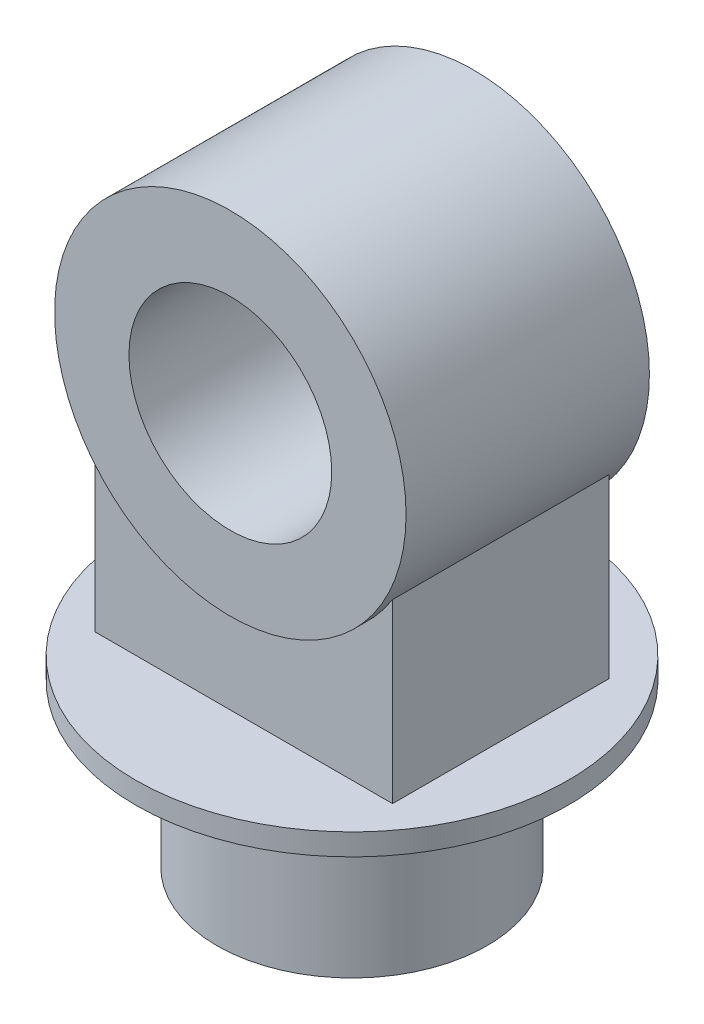
ISO-10303-21;
HEADER;
FILE_DESCRIPTION(('STEP AP214'),'2;1');
FILE_NAME('part.step','',(''),(''),'','','');
FILE_SCHEMA(('AUTOMOTIVE_DESIGN { 1 0 10303 214 1 1 1 1 }'));
ENDSEC;
DATA;
#1=APPLICATION_CONTEXT('core data for automotive mechanical design processes');
#2=APPLICATION_PROTOCOL_DEFINITION('international standard','automotive_design',2000,#1);
#3=PRODUCT_CONTEXT('',#1,'mechanical');
#4=PRODUCT('Part','Part','',(#3));
#5=PRODUCT_RELATED_PRODUCT_CATEGORY('part','',(#4));
#6=PRODUCT_DEFINITION_FORMATION('','',#4);
#7=PRODUCT_DEFINITION_CONTEXT('part definition',#1,'design');
#8=PRODUCT_DEFINITION('design','',#6,#7);
#9=PRODUCT_DEFINITION_SHAPE('','',#8);
#10=(LENGTH_UNIT() NAMED_UNIT(*) SI_UNIT(.MILLI.,.METRE.));
#11=(NAMED_UNIT(*) PLANE_ANGLE_UNIT() SI_UNIT($,.RADIAN.));
#12=(NAMED_UNIT(*) SI_UNIT($,.STERADIAN.) SOLID_ANGLE_UNIT());
#13=UNCERTAINTY_MEASURE_WITH_UNIT(LENGTH_MEASURE(1.E-05),#10,'distance_accuracy_value','');
#14=(GEOMETRIC_REPRESENTATION_CONTEXT(3) GLOBAL_UNCERTAINTY_ASSIGNED_CONTEXT((#13)) GLOBAL_UNIT_ASSIGNED_CONTEXT((#10,
#11,#12)) REPRESENTATION_CONTEXT('',''));
#15=CARTESIAN_POINT('',(0.,0.,0.));
#16=DIRECTION('',(0.,0.,1.));
#17=DIRECTION('',(1.,0.,0.));
#18=AXIS2_PLACEMENT_3D('',#15,#16,#17);
#19=CARTESIAN_POINT('',(0.,120.,0.));
#20=DIRECTION('',(0.,-1.,0.));
#21=DIRECTION('',(0.,0.,-1.));
#22=AXIS2_PLACEMENT_3D('',#19,#20,#21);
#23=CYLINDRICAL_SURFACE('',#22,100.);
#24=CARTESIAN_POINT('',(0.,120.,0.));
#25=DIRECTION('',(0.,1.,0.));
#26=DIRECTION('',(0.,0.,1.));
#27=AXIS2_PLACEMENT_3D('',#24,#25,#26);
#28=CIRCLE('',#27,100.);
#29=CARTESIAN_POINT('',(0.,120.,100.));
#30=VERTEX_POINT('',#29);
#31=EDGE_CURVE('E11',#30,#30,#28,.T.);
#32=ORIENTED_EDGE('',*,*,#31,.F.);
#33=EDGE_LOOP('',(#32));
#34=FACE_BOUND('',#33,.T.);
#35=CARTESIAN_POINT('',(0.,0.,0.));
#36=DIRECTION('',(0.,1.,0.));
#37=DIRECTION('',(0.,0.,1.));
#38=AXIS2_PLACEMENT_3D('',#35,#36,#37);
#39=CIRCLE('',#38,100.);
#40=CARTESIAN_POINT('',(0.,0.,100.));
#41=VERTEX_POINT('',#40);
#42=EDGE_CURVE('E48',#41,#41,#39,.T.);
#43=ORIENTED_EDGE('',*,*,#42,.T.);
#44=EDGE_LOOP('',(#43));
#45=FACE_BOUND('',#44,.T.);
#46=ADVANCED_FACE('F45',(#34,#45),#23,.T.);
#47=CARTESIAN_POINT('',(0.,0.,0.));
#48=DIRECTION('',(0.,1.,0.));
#49=DIRECTION('',(0.,0.,1.));
#50=AXIS2_PLACEMENT_3D('',#47,#48,#49);
#51=PLANE('',#50);
#52=ORIENTED_EDGE('',*,*,#42,.F.);
#53=EDGE_LOOP('',(#52));
#54=FACE_BOUND('',#53,.T.);
#55=ADVANCED_FACE('F121',(#54),#51,.F.);
#56=CARTESIAN_POINT('',(0.,136.,0.));
#57=DIRECTION('',(0.,-1.,0.));
#58=DIRECTION('',(0.,0.,-1.));
#59=AXIS2_PLACEMENT_3D('',#56,#57,#58);
#60=CYLINDRICAL_SURFACE('',#59,160.);
#61=CARTESIAN_POINT('',(0.,136.,0.));
#62=DIRECTION('',(0.,1.,0.));
#63=DIRECTION('',(0.,0.,1.));
#64=AXIS2_PLACEMENT_3D('',#61,#62,#63);
#65=CIRCLE('',#64,160.);
#66=CARTESIAN_POINT('',(0.,136.,160.));
#67=VERTEX_POINT('',#66);
#68=EDGE_CURVE('E108',#67,#67,#65,.T.);
#69=ORIENTED_EDGE('',*,*,#68,.F.);
#70=EDGE_LOOP('',(#69));
#71=FACE_BOUND('',#70,.T.);
#72=CARTESIAN_POINT('',(0.,120.,0.));
#73=DIRECTION('',(0.,1.,0.));
#74=DIRECTION('',(0.,0.,1.));
#75=AXIS2_PLACEMENT_3D('',#72,#73,#74);
#76=CIRCLE('',#75,160.);
#77=CARTESIAN_POINT('',(0.,120.,160.));
#78=VERTEX_POINT('',#77);
#79=EDGE_CURVE('E105',#78,#78,#76,.T.);
#80=ORIENTED_EDGE('',*,*,#79,.T.);
#81=EDGE_LOOP('',(#80));
#82=FACE_BOUND('',#81,.T.);
#83=ADVANCED_FACE('F123',(#71,#82),#60,.T.);
#84=CARTESIAN_POINT('',(0.,136.,0.));
#85=DIRECTION('',(0.,1.,0.));
#86=DIRECTION('',(0.,0.,1.));
#87=AXIS2_PLACEMENT_3D('',#84,#85,#86);
#88=PLANE('',#87);
#89=DIRECTION('',(0.,0.,1.));
#90=VECTOR('',#89,1.);
#91=CARTESIAN_POINT('',(-110.,136.,80.0000000000001));
#92=LINE('',#91,#90);
#93=CARTESIAN_POINT('',(-110.,136.,-79.9999999999999));
#94=VERTEX_POINT('',#93);
#95=CARTESIAN_POINT('',(-110.,136.,80.0000000000001));
#96=VERTEX_POINT('',#95);
#97=EDGE_CURVE('E59',#94,#96,#92,.T.);
#98=ORIENTED_EDGE('',*,*,#97,.F.);
#99=DIRECTION('',(-1.,0.,0.));
#100=VECTOR('',#99,1.);
#101=CARTESIAN_POINT('',(110.,136.,-80.));
#102=LINE('',#101,#100);
#103=CARTESIAN_POINT('',(110.,136.,-80.));
#104=VERTEX_POINT('',#103);
#105=EDGE_CURVE('E64',#104,#94,#102,.T.);
#106=ORIENTED_EDGE('',*,*,#105,.F.);
#107=DIRECTION('',(0.,0.,-1.));
#108=VECTOR('',#107,1.);
#109=CARTESIAN_POINT('',(110.,136.,80.));
#110=LINE('',#109,#108);
#111=CARTESIAN_POINT('',(110.,136.,80.));
#112=VERTEX_POINT('',#111);
#113=EDGE_CURVE('E185',#112,#104,#110,.T.);
#114=ORIENTED_EDGE('',*,*,#113,.F.);
#115=DIRECTION('',(1.,0.,0.));
#116=VECTOR('',#115,1.);
#117=CARTESIAN_POINT('',(110.,136.,80.));
#118=LINE('',#117,#116);
#119=EDGE_CURVE('E90',#96,#112,#118,.T.);
#120=ORIENTED_EDGE('',*,*,#119,.F.);
#121=EDGE_LOOP('',(#98,#106,#114,#120));
#122=FACE_BOUND('',#121,.T.);
#123=ORIENTED_EDGE('',*,*,#68,.T.);
#124=EDGE_LOOP('',(#123));
#125=FACE_BOUND('',#124,.T.);
#126=ADVANCED_FACE('F128',(#122,#125),#88,.T.);
#127=CARTESIAN_POINT('',(0.,120.,0.));
#128=DIRECTION('',(0.,1.,0.));
#129=DIRECTION('',(0.,0.,1.));
#130=AXIS2_PLACEMENT_3D('',#127,#128,#129);
#131=PLANE('',#130);
#132=ORIENTED_EDGE('',*,*,#31,.T.);
#133=EDGE_LOOP('',(#132));
#134=FACE_BOUND('',#133,.T.);
#135=ORIENTED_EDGE('',*,*,#79,.F.);
#136=EDGE_LOOP('',(#135));
#137=FACE_BOUND('',#136,.T.);
#138=ADVANCED_FACE('F133',(#134,#137),#131,.F.);
#139=CARTESIAN_POINT('',(110.,466.002,80.));
#140=DIRECTION('',(0.,0.,-1.));
#141=DIRECTION('',(-1.,0.,0.));
#142=AXIS2_PLACEMENT_3D('',#139,#140,#141);
#143=PLANE('',#142);
#144=CARTESIAN_POINT('',(0.,336.,80.));
#145=DIRECTION('',(0.,0.,-1.));
#146=DIRECTION('',(-1.,0.,0.));
#147=AXIS2_PLACEMENT_3D('',#144,#145,#146);
#148=CIRCLE('',#147,130.);
#149=CARTESIAN_POINT('',(-110.,266.717967697245,80.0000000000001));
#150=VERTEX_POINT('',#149);
#151=CARTESIAN_POINT('',(110.,266.717967697245,80.));
#152=VERTEX_POINT('',#151);
#153=EDGE_CURVE('E100',#150,#152,#148,.F.);
#154=ORIENTED_EDGE('',*,*,#153,.F.);
#155=DIRECTION('',(0.,-1.,0.));
#156=VECTOR('',#155,1.);
#157=CARTESIAN_POINT('',(-110.,466.002,80.0000000000001));
#158=LINE('',#157,#156);
#159=EDGE_CURVE('E97',#150,#96,#158,.T.);
#160=ORIENTED_EDGE('',*,*,#159,.T.);
#161=ORIENTED_EDGE('',*,*,#119,.T.);
#162=DIRECTION('',(0.,-1.,0.));
#163=VECTOR('',#162,1.);
#164=CARTESIAN_POINT('',(110.,466.002,80.));
#165=LINE('',#164,#163);
#166=EDGE_CURVE('E191',#152,#112,#165,.T.);
#167=ORIENTED_EDGE('',*,*,#166,.F.);
#168=EDGE_LOOP('',(#154,#160,#161,#167));
#169=FACE_BOUND('',#168,.T.);
#170=ADVANCED_FACE('F136',(#169),#143,.F.);
#171=CARTESIAN_POINT('',(-110.,466.002,80.0000000000001));
#172=DIRECTION('',(1.,0.,0.));
#173=DIRECTION('',(0.,0.,-1.));
#174=AXIS2_PLACEMENT_3D('',#171,#172,#173);
#175=PLANE('',#174);
#176=DIRECTION('',(0.,0.,-1.));
#177=VECTOR('',#176,1.);
#178=CARTESIAN_POINT('',(-110.,266.717967697245,90.));
#179=LINE('',#178,#177);
#180=CARTESIAN_POINT('',(-110.,266.717967697245,-79.9999999999999));
#181=VERTEX_POINT('',#180);
#182=EDGE_CURVE('E94',#181,#150,#179,.F.);
#183=ORIENTED_EDGE('',*,*,#182,.F.);
#184=DIRECTION('',(0.,-1.,0.));
#185=VECTOR('',#184,1.);
#186=CARTESIAN_POINT('',(-110.,466.002,-79.9999999999999));
#187=LINE('',#186,#185);
#188=EDGE_CURVE('E82',#181,#94,#187,.T.);
#189=ORIENTED_EDGE('',*,*,#188,.T.);
#190=ORIENTED_EDGE('',*,*,#97,.T.);
#191=ORIENTED_EDGE('',*,*,#159,.F.);
#192=EDGE_LOOP('',(#183,#189,#190,#191));
#193=FACE_BOUND('',#192,.T.);
#194=ADVANCED_FACE('F95',(#193),#175,.F.);
#195=CARTESIAN_POINT('',(110.,466.002,80.));
#196=DIRECTION('',(-1.,0.,0.));
#197=DIRECTION('',(0.,0.,1.));
#198=AXIS2_PLACEMENT_3D('',#195,#196,#197);
#199=PLANE('',#198);
#200=DIRECTION('',(0.,0.,-1.));
#201=VECTOR('',#200,1.);
#202=CARTESIAN_POINT('',(110.,266.717967697245,90.));
#203=LINE('',#202,#201);
#204=CARTESIAN_POINT('',(110.,266.717967697245,-80.));
#205=VERTEX_POINT('',#204);
#206=EDGE_CURVE('E104',#152,#205,#203,.T.);
#207=ORIENTED_EDGE('',*,*,#206,.F.);
#208=ORIENTED_EDGE('',*,*,#166,.T.);
#209=ORIENTED_EDGE('',*,*,#113,.T.);
#210=DIRECTION('',(0.,-1.,0.));
#211=VECTOR('',#210,1.);
#212=CARTESIAN_POINT('',(110.,466.002,-80.));
#213=LINE('',#212,#211);
#214=EDGE_CURVE('E89',#205,#104,#213,.T.);
#215=ORIENTED_EDGE('',*,*,#214,.F.);
#216=EDGE_LOOP('',(#207,#208,#209,#215));
#217=FACE_BOUND('',#216,.T.);
#218=ADVANCED_FACE('F142',(#217),#199,.F.);
#219=CARTESIAN_POINT('',(110.,466.002,-80.));
#220=DIRECTION('',(0.,0.,1.));
#221=DIRECTION('',(1.,0.,0.));
#222=AXIS2_PLACEMENT_3D('',#219,#220,#221);
#223=PLANE('',#222);
#224=CARTESIAN_POINT('',(0.,336.,-80.));
#225=DIRECTION('',(0.,0.,1.));
#226=DIRECTION('',(1.,0.,0.));
#227=AXIS2_PLACEMENT_3D('',#224,#225,#226);
#228=CIRCLE('',#227,130.);
#229=EDGE_CURVE('E86',#205,#181,#228,.F.);
#230=ORIENTED_EDGE('',*,*,#229,.F.);
#231=ORIENTED_EDGE('',*,*,#214,.T.);
#232=ORIENTED_EDGE('',*,*,#105,.T.);
#233=ORIENTED_EDGE('',*,*,#188,.F.);
#234=EDGE_LOOP('',(#230,#231,#232,#233));
#235=FACE_BOUND('',#234,.T.);
#236=ADVANCED_FACE('F84',(#235),#223,.F.);
#237=CARTESIAN_POINT('',(0.,336.,90.));
#238=DIRECTION('',(0.,0.,-1.));
#239=DIRECTION('',(-1.,0.,0.));
#240=AXIS2_PLACEMENT_3D('',#237,#238,#239);
#241=CYLINDRICAL_SURFACE('',#240,130.);
#242=CARTESIAN_POINT('',(0.,336.,90.));
#243=DIRECTION('',(0.,0.,1.));
#244=DIRECTION('',(1.,0.,0.));
#245=AXIS2_PLACEMENT_3D('',#242,#243,#244);
#246=CIRCLE('',#245,130.);
#247=CARTESIAN_POINT('',(130.,336.,90.));
#248=VERTEX_POINT('',#247);
#249=EDGE_CURVE('E173',#248,#248,#246,.T.);
#250=ORIENTED_EDGE('',*,*,#249,.F.);
#251=EDGE_LOOP('',(#250));
#252=FACE_BOUND('',#251,.T.);
#253=CARTESIAN_POINT('',(0.,336.,-90.));
#254=DIRECTION('',(0.,0.,1.));
#255=DIRECTION('',(1.,0.,0.));
#256=AXIS2_PLACEMENT_3D('',#253,#254,#255);
#257=CIRCLE('',#256,130.);
#258=CARTESIAN_POINT('',(130.,336.,-90.));
#259=VERTEX_POINT('',#258);
#260=EDGE_CURVE('E176',#259,#259,#257,.T.);
#261=ORIENTED_EDGE('',*,*,#260,.T.);
#262=EDGE_LOOP('',(#261));
#263=FACE_BOUND('',#262,.T.);
#264=ORIENTED_EDGE('',*,*,#182,.T.);
#265=ORIENTED_EDGE('',*,*,#153,.T.);
#266=ORIENTED_EDGE('',*,*,#206,.T.);
#267=ORIENTED_EDGE('',*,*,#229,.T.);
#268=EDGE_LOOP('',(#264,#265,#266,#267));
#269=FACE_BOUND('',#268,.T.);
#270=ADVANCED_FACE('F103',(#252,#263,#269),#241,.T.);
#271=CARTESIAN_POINT('',(0.,336.,90.));
#272=DIRECTION('',(0.,0.,-1.));
#273=DIRECTION('',(-1.,0.,0.));
#274=AXIS2_PLACEMENT_3D('',#271,#272,#273);
#275=CYLINDRICAL_SURFACE('',#274,75.);
#276=CARTESIAN_POINT('',(0.,336.,90.));
#277=DIRECTION('',(0.,0.,1.));
#278=DIRECTION('',(1.,0.,0.));
#279=AXIS2_PLACEMENT_3D('',#276,#277,#278);
#280=CIRCLE('',#279,75.);
#281=CARTESIAN_POINT('',(-75.,336.,90.));
#282=VERTEX_POINT('',#281);
#283=EDGE_CURVE('E170',#282,#282,#280,.T.);
#284=CARTESIAN_POINT('',(0.,336.,-90.));
#285=DIRECTION('',(0.,0.,1.));
#286=DIRECTION('',(1.,0.,0.));
#287=AXIS2_PLACEMENT_3D('',#284,#285,#286);
#288=CIRCLE('',#287,75.);
#289=CARTESIAN_POINT('',(-75.,336.,-90.));
#290=VERTEX_POINT('',#289);
#291=EDGE_CURVE('E179',#290,#290,#288,.T.);
#292=CARTESIAN_POINT('',(-75.,336.,90.));
#293=CARTESIAN_POINT('',(-75.,336.,88.125));
#294=CARTESIAN_POINT('',(-75.,336.,86.25));
#295=CARTESIAN_POINT('',(-75.,336.,82.5));
#296=CARTESIAN_POINT('',(-75.,336.,80.625));
#297=CARTESIAN_POINT('',(-75.,336.,76.875));
#298=CARTESIAN_POINT('',(-75.,336.,75.));
#299=CARTESIAN_POINT('',(-75.,336.,71.25));
#300=CARTESIAN_POINT('',(-75.,336.,69.375));
#301=CARTESIAN_POINT('',(-75.,336.,65.625));
#302=CARTESIAN_POINT('',(-75.,336.,63.75));
#303=CARTESIAN_POINT('',(-75.,336.,60.));
#304=CARTESIAN_POINT('',(-75.,336.,58.125));
#305=CARTESIAN_POINT('',(-75.,336.,54.375));
#306=CARTESIAN_POINT('',(-75.,336.,52.5));
#307=CARTESIAN_POINT('',(-75.,336.,48.75));
#308=CARTESIAN_POINT('',(-75.,336.,46.875));
#309=CARTESIAN_POINT('',(-75.,336.,43.125));
#310=CARTESIAN_POINT('',(-75.,336.,41.25));
#311=CARTESIAN_POINT('',(-75.,336.,37.5));
#312=CARTESIAN_POINT('',(-75.,336.,35.625));
#313=CARTESIAN_POINT('',(-75.,336.,31.875));
#314=CARTESIAN_POINT('',(-75.,336.,30.));
#315=CARTESIAN_POINT('',(-75.,336.,26.25));
#316=CARTESIAN_POINT('',(-75.,336.,24.375));
#317=CARTESIAN_POINT('',(-75.,336.,20.625));
#318=CARTESIAN_POINT('',(-75.,336.,18.75));
#319=CARTESIAN_POINT('',(-75.,336.,15.));
#320=CARTESIAN_POINT('',(-75.,336.,13.125));
#321=CARTESIAN_POINT('',(-75.,336.,9.37499999999998));
#322=CARTESIAN_POINT('',(-75.,336.,7.49999999999998));
#323=CARTESIAN_POINT('',(-75.,336.,3.74999999999998));
#324=CARTESIAN_POINT('',(-75.,336.,1.87499999999997));
#325=CARTESIAN_POINT('',(-75.,336.,-1.87500000000003));
#326=CARTESIAN_POINT('',(-75.,336.,-3.75000000000003));
#327=CARTESIAN_POINT('',(-75.,336.,-7.50000000000003));
#328=CARTESIAN_POINT('',(-75.,336.,-9.37500000000004));
#329=CARTESIAN_POINT('',(-75.,336.,-13.125));
#330=CARTESIAN_POINT('',(-75.,336.,-15.));
#331=CARTESIAN_POINT('',(-75.,336.,-18.75));
#332=CARTESIAN_POINT('',(-75.,336.,-20.625));
#333=CARTESIAN_POINT('',(-75.,336.,-24.375));
#334=CARTESIAN_POINT('',(-75.,336.,-26.25));
#335=CARTESIAN_POINT('',(-75.,336.,-30.));
#336=CARTESIAN_POINT('',(-75.,336.,-31.875));
#337=CARTESIAN_POINT('',(-75.,336.,-35.625));
#338=CARTESIAN_POINT('',(-75.,336.,-37.5));
#339=CARTESIAN_POINT('',(-75.,336.,-41.25));
#340=CARTESIAN_POINT('',(-75.,336.,-43.125));
#341=CARTESIAN_POINT('',(-75.,336.,-46.875));
#342=CARTESIAN_POINT('',(-75.,336.,-48.75));
#343=CARTESIAN_POINT('',(-75.,336.,-52.5));
#344=CARTESIAN_POINT('',(-75.,336.,-54.375));
#345=CARTESIAN_POINT('',(-75.,336.,-58.125));
#346=CARTESIAN_POINT('',(-75.,336.,-60.));
#347=CARTESIAN_POINT('',(-75.,336.,-63.75));
#348=CARTESIAN_POINT('',(-75.,336.,-65.625));
#349=CARTESIAN_POINT('',(-75.,336.,-69.375));
#350=CARTESIAN_POINT('',(-75.,336.,-71.25));
#351=CARTESIAN_POINT('',(-75.,336.,-75.));
#352=CARTESIAN_POINT('',(-75.,336.,-76.875));
#353=CARTESIAN_POINT('',(-75.,336.,-80.625));
#354=CARTESIAN_POINT('',(-75.,336.,-82.5));
#355=CARTESIAN_POINT('',(-75.,336.,-86.25));
#356=CARTESIAN_POINT('',(-75.,336.,-88.125));
#357=CARTESIAN_POINT('',(-75.,336.,-90.));
#358=B_SPLINE_CURVE_WITH_KNOTS('',3,(#292,#293,#294,#295,#296,#297,#298,#299,#300,#301,#302,
#303,#304,#305,#306,#307,#308,#309,#310,#311,#312,#313,#314,#315,#316,#317,#318,#319,#320,#321,
#322,#323,#324,#325,#326,#327,#328,#329,#330,#331,#332,#333,#334,#335,#336,#337,#338,#339,#340,
#341,#342,#343,#344,#345,#346,#347,#348,#349,#350,#351,#352,#353,#354,#355,#356,#357),
.UNSPECIFIED.,.F.,.F.,(4,2,2,2,2,2,2,2,2,2,2,2,2,2,2,2,2,2,2,2,2,2,2,2,2,2,2,2,2,2,2,2,4),(0.,
5.62499999999999,11.25,16.875,22.5,28.125,33.75,39.375,45.,50.625,56.25,61.875,67.5,73.125,
78.75,84.375,90.,95.625,101.25,106.875,112.5,118.125,123.75,129.375,135.,140.625,146.25,151.875,
157.5,163.125,168.75,174.375,180.),.UNSPECIFIED.);
#359=EDGE_CURVE('BSEAM151',#282,#290,#358,.T.);
#360=ORIENTED_EDGE('',*,*,#283,.T.);
#361=ORIENTED_EDGE('',*,*,#291,.F.);
#362=ORIENTED_EDGE('',*,*,#359,.T.);
#363=ORIENTED_EDGE('',*,*,#359,.F.);
#364=EDGE_LOOP('',(#360,#362,#361,#363));
#365=FACE_BOUND('',#364,.T.);
#366=ADVANCED_FACE('F151',(#365),#275,.F.);
#367=CARTESIAN_POINT('',(0.,0.,90.));
#368=DIRECTION('',(0.,0.,1.));
#369=DIRECTION('',(1.,0.,0.));
#370=AXIS2_PLACEMENT_3D('',#367,#368,#369);
#371=PLANE('',#370);
#372=ORIENTED_EDGE('',*,*,#283,.F.);
#373=EDGE_LOOP('',(#372));
#374=FACE_BOUND('',#373,.T.);
#375=ORIENTED_EDGE('',*,*,#249,.T.);
#376=EDGE_LOOP('',(#375));
#377=FACE_BOUND('',#376,.T.);
#378=ADVANCED_FACE('F154',(#374,#377),#371,.T.);
#379=CARTESIAN_POINT('',(0.,0.,-90.));
#380=DIRECTION('',(0.,0.,1.));
#381=DIRECTION('',(1.,0.,0.));
#382=AXIS2_PLACEMENT_3D('',#379,#380,#381);
#383=PLANE('',#382);
#384=ORIENTED_EDGE('',*,*,#291,.T.);
#385=EDGE_LOOP('',(#384));
#386=FACE_BOUND('',#385,.T.);
#387=ORIENTED_EDGE('',*,*,#260,.F.);
#388=EDGE_LOOP('',(#387));
#389=FACE_BOUND('',#388,.T.);
#390=ADVANCED_FACE('F159',(#386,#389),#383,.F.);
#391=CLOSED_SHELL('',(#46,#55,#83,#126,#138,#170,#194,#218,#236,#270,#366,#378,#390));
#392=MANIFOLD_SOLID_BREP('B2',#391);
#393=ADVANCED_BREP_SHAPE_REPRESENTATION('',(#18,#392),#14);
#394=SHAPE_DEFINITION_REPRESENTATION(#9,#393);
ENDSEC;
END-ISO-10303-21;
